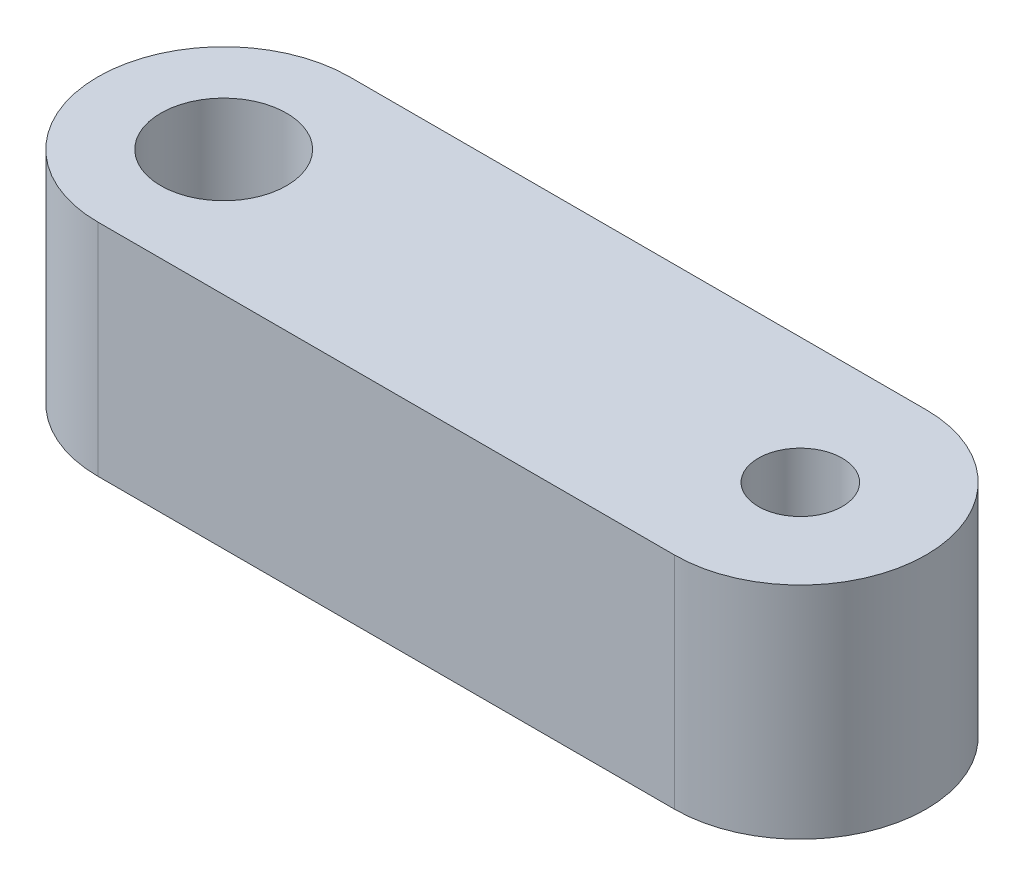
ISO-10303-21;
HEADER;
FILE_DESCRIPTION(('STEP AP214'),'2;1');
FILE_NAME('part.step','',(''),(''),'','','');
FILE_SCHEMA(('AUTOMOTIVE_DESIGN { 1 0 10303 214 1 1 1 1 }'));
ENDSEC;
DATA;
#1=APPLICATION_CONTEXT('core data for automotive mechanical design processes');
#2=APPLICATION_PROTOCOL_DEFINITION('international standard','automotive_design',2000,#1);
#3=PRODUCT_CONTEXT('',#1,'mechanical');
#4=PRODUCT('Part','Part','',(#3));
#5=PRODUCT_RELATED_PRODUCT_CATEGORY('part','',(#4));
#6=PRODUCT_DEFINITION_FORMATION('','',#4);
#7=PRODUCT_DEFINITION_CONTEXT('part definition',#1,'design');
#8=PRODUCT_DEFINITION('design','',#6,#7);
#9=PRODUCT_DEFINITION_SHAPE('','',#8);
#10=(LENGTH_UNIT() NAMED_UNIT(*) SI_UNIT(.MILLI.,.METRE.));
#11=(NAMED_UNIT(*) PLANE_ANGLE_UNIT() SI_UNIT($,.RADIAN.));
#12=(NAMED_UNIT(*) SI_UNIT($,.STERADIAN.) SOLID_ANGLE_UNIT());
#13=UNCERTAINTY_MEASURE_WITH_UNIT(LENGTH_MEASURE(1.E-05),#10,'distance_accuracy_value','');
#14=(GEOMETRIC_REPRESENTATION_CONTEXT(3) GLOBAL_UNCERTAINTY_ASSIGNED_CONTEXT((#13)) GLOBAL_UNIT_ASSIGNED_CONTEXT((#10,
#11,#12)) REPRESENTATION_CONTEXT('',''));
#15=CARTESIAN_POINT('',(0.,0.,0.));
#16=DIRECTION('',(0.,0.,1.));
#17=DIRECTION('',(1.,0.,0.));
#18=AXIS2_PLACEMENT_3D('',#15,#16,#17);
#19=CARTESIAN_POINT('',(0.,5.25,0.));
#20=DIRECTION('',(0.,-1.,0.));
#21=DIRECTION('',(0.,0.,-1.));
#22=AXIS2_PLACEMENT_3D('',#19,#20,#21);
#23=CYLINDRICAL_SURFACE('',#22,3.);
#24=CARTESIAN_POINT('',(0.,0.,0.));
#25=DIRECTION('',(0.,1.,0.));
#26=DIRECTION('',(0.,0.,1.));
#27=AXIS2_PLACEMENT_3D('',#24,#25,#26);
#28=CIRCLE('',#27,3.);
#29=CARTESIAN_POINT('',(0.,0.,-3.));
#30=VERTEX_POINT('',#29);
#31=CARTESIAN_POINT('',(0.,0.,3.));
#32=VERTEX_POINT('',#31);
#33=EDGE_CURVE('E97',#30,#32,#28,.T.);
#34=ORIENTED_EDGE('',*,*,#33,.T.);
#35=DIRECTION('',(0.,-1.,0.));
#36=VECTOR('',#35,1.);
#37=CARTESIAN_POINT('',(0.,5.25,3.));
#38=LINE('',#37,#36);
#39=CARTESIAN_POINT('',(0.,5.25,3.));
#40=VERTEX_POINT('',#39);
#41=EDGE_CURVE('E11',#40,#32,#38,.T.);
#42=ORIENTED_EDGE('',*,*,#41,.F.);
#43=CARTESIAN_POINT('',(0.,5.25,0.));
#44=DIRECTION('',(0.,1.,0.));
#45=DIRECTION('',(0.,0.,1.));
#46=AXIS2_PLACEMENT_3D('',#43,#44,#45);
#47=CIRCLE('',#46,3.);
#48=CARTESIAN_POINT('',(0.,5.25,-3.));
#49=VERTEX_POINT('',#48);
#50=EDGE_CURVE('E85',#49,#40,#47,.T.);
#51=ORIENTED_EDGE('',*,*,#50,.F.);
#52=DIRECTION('',(0.,-1.,0.));
#53=VECTOR('',#52,1.);
#54=CARTESIAN_POINT('',(0.,5.25,-3.));
#55=LINE('',#54,#53);
#56=EDGE_CURVE('E93',#49,#30,#55,.T.);
#57=ORIENTED_EDGE('',*,*,#56,.T.);
#58=EDGE_LOOP('',(#34,#42,#51,#57));
#59=FACE_BOUND('',#58,.T.);
#60=ADVANCED_FACE('F34',(#59),#23,.T.);
#61=CARTESIAN_POINT('',(0.,5.25,3.));
#62=DIRECTION('',(0.,0.,-1.));
#63=DIRECTION('',(-1.,0.,0.));
#64=AXIS2_PLACEMENT_3D('',#61,#62,#63);
#65=PLANE('',#64);
#66=DIRECTION('',(1.,0.,0.));
#67=VECTOR('',#66,1.);
#68=CARTESIAN_POINT('',(0.,0.,3.));
#69=LINE('',#68,#67);
#70=CARTESIAN_POINT('',(13.75,0.,3.));
#71=VERTEX_POINT('',#70);
#72=EDGE_CURVE('E89',#32,#71,#69,.T.);
#73=ORIENTED_EDGE('',*,*,#72,.T.);
#74=DIRECTION('',(0.,-1.,0.));
#75=VECTOR('',#74,1.);
#76=CARTESIAN_POINT('',(13.75,5.25,3.));
#77=LINE('',#76,#75);
#78=CARTESIAN_POINT('',(13.75,5.25,3.));
#79=VERTEX_POINT('',#78);
#80=EDGE_CURVE('E42',#79,#71,#77,.T.);
#81=ORIENTED_EDGE('',*,*,#80,.F.);
#82=DIRECTION('',(1.,0.,0.));
#83=VECTOR('',#82,1.);
#84=CARTESIAN_POINT('',(0.,5.25,3.));
#85=LINE('',#84,#83);
#86=EDGE_CURVE('E80',#40,#79,#85,.T.);
#87=ORIENTED_EDGE('',*,*,#86,.F.);
#88=ORIENTED_EDGE('',*,*,#41,.T.);
#89=EDGE_LOOP('',(#73,#81,#87,#88));
#90=FACE_BOUND('',#89,.T.);
#91=ADVANCED_FACE('F88',(#90),#65,.F.);
#92=CARTESIAN_POINT('',(13.75,5.25,0.));
#93=DIRECTION('',(0.,-1.,0.));
#94=DIRECTION('',(0.,0.,-1.));
#95=AXIS2_PLACEMENT_3D('',#92,#93,#94);
#96=CYLINDRICAL_SURFACE('',#95,3.);
#97=CARTESIAN_POINT('',(13.75,0.,0.));
#98=DIRECTION('',(0.,1.,0.));
#99=DIRECTION('',(0.,0.,1.));
#100=AXIS2_PLACEMENT_3D('',#97,#98,#99);
#101=CIRCLE('',#100,3.);
#102=CARTESIAN_POINT('',(13.75,0.,-3.));
#103=VERTEX_POINT('',#102);
#104=EDGE_CURVE('E67',#71,#103,#101,.T.);
#105=ORIENTED_EDGE('',*,*,#104,.T.);
#106=DIRECTION('',(0.,-1.,0.));
#107=VECTOR('',#106,1.);
#108=CARTESIAN_POINT('',(13.75,5.25,-3.));
#109=LINE('',#108,#107);
#110=CARTESIAN_POINT('',(13.75,5.25,-3.));
#111=VERTEX_POINT('',#110);
#112=EDGE_CURVE('E90',#111,#103,#109,.T.);
#113=ORIENTED_EDGE('',*,*,#112,.F.);
#114=CARTESIAN_POINT('',(13.75,5.25,0.));
#115=DIRECTION('',(0.,1.,0.));
#116=DIRECTION('',(0.,0.,1.));
#117=AXIS2_PLACEMENT_3D('',#114,#115,#116);
#118=CIRCLE('',#117,3.);
#119=EDGE_CURVE('E83',#79,#111,#118,.T.);
#120=ORIENTED_EDGE('',*,*,#119,.F.);
#121=ORIENTED_EDGE('',*,*,#80,.T.);
#122=EDGE_LOOP('',(#105,#113,#120,#121));
#123=FACE_BOUND('',#122,.T.);
#124=ADVANCED_FACE('F91',(#123),#96,.T.);
#125=CARTESIAN_POINT('',(0.,5.25,-3.));
#126=DIRECTION('',(0.,0.,1.));
#127=DIRECTION('',(1.,0.,0.));
#128=AXIS2_PLACEMENT_3D('',#125,#126,#127);
#129=PLANE('',#128);
#130=DIRECTION('',(-1.,0.,0.));
#131=VECTOR('',#130,1.);
#132=CARTESIAN_POINT('',(0.,0.,-3.));
#133=LINE('',#132,#131);
#134=EDGE_CURVE('E73',#103,#30,#133,.T.);
#135=ORIENTED_EDGE('',*,*,#134,.T.);
#136=ORIENTED_EDGE('',*,*,#56,.F.);
#137=DIRECTION('',(-1.,0.,0.));
#138=VECTOR('',#137,1.);
#139=CARTESIAN_POINT('',(0.,5.25,-3.));
#140=LINE('',#139,#138);
#141=EDGE_CURVE('E50',#111,#49,#140,.T.);
#142=ORIENTED_EDGE('',*,*,#141,.F.);
#143=ORIENTED_EDGE('',*,*,#112,.T.);
#144=EDGE_LOOP('',(#135,#136,#142,#143));
#145=FACE_BOUND('',#144,.T.);
#146=ADVANCED_FACE('F105',(#145),#129,.F.);
#147=CARTESIAN_POINT('',(0.,5.25,0.));
#148=DIRECTION('',(0.,1.,0.));
#149=DIRECTION('',(0.,0.,1.));
#150=AXIS2_PLACEMENT_3D('',#147,#148,#149);
#151=PLANE('',#150);
#152=CARTESIAN_POINT('',(0.,5.25,0.));
#153=DIRECTION('',(0.,1.,0.));
#154=DIRECTION('',(0.,0.,1.));
#155=AXIS2_PLACEMENT_3D('',#152,#153,#154);
#156=CIRCLE('',#155,1.5);
#157=CARTESIAN_POINT('',(0.,5.25,1.5));
#158=VERTEX_POINT('',#157);
#159=EDGE_CURVE('E114',#158,#158,#156,.T.);
#160=ORIENTED_EDGE('',*,*,#159,.F.);
#161=EDGE_LOOP('',(#160));
#162=FACE_BOUND('',#161,.T.);
#163=CARTESIAN_POINT('',(13.75,5.25,0.));
#164=DIRECTION('',(0.,1.,0.));
#165=DIRECTION('',(0.,0.,1.));
#166=AXIS2_PLACEMENT_3D('',#163,#164,#165);
#167=CIRCLE('',#166,1.);
#168=CARTESIAN_POINT('',(13.75,5.25,1.));
#169=VERTEX_POINT('',#168);
#170=EDGE_CURVE('E115',#169,#169,#167,.T.);
#171=ORIENTED_EDGE('',*,*,#170,.F.);
#172=EDGE_LOOP('',(#171));
#173=FACE_BOUND('',#172,.T.);
#174=ORIENTED_EDGE('',*,*,#50,.T.);
#175=ORIENTED_EDGE('',*,*,#86,.T.);
#176=ORIENTED_EDGE('',*,*,#119,.T.);
#177=ORIENTED_EDGE('',*,*,#141,.T.);
#178=EDGE_LOOP('',(#174,#175,#176,#177));
#179=FACE_BOUND('',#178,.T.);
#180=ADVANCED_FACE('F81',(#162,#173,#179),#151,.T.);
#181=CARTESIAN_POINT('',(0.,0.,0.));
#182=DIRECTION('',(0.,1.,0.));
#183=DIRECTION('',(0.,0.,1.));
#184=AXIS2_PLACEMENT_3D('',#181,#182,#183);
#185=PLANE('',#184);
#186=CARTESIAN_POINT('',(0.,0.,0.));
#187=DIRECTION('',(0.,1.,0.));
#188=DIRECTION('',(0.,0.,1.));
#189=AXIS2_PLACEMENT_3D('',#186,#187,#188);
#190=CIRCLE('',#189,1.5);
#191=CARTESIAN_POINT('',(0.,0.,1.5));
#192=VERTEX_POINT('',#191);
#193=EDGE_CURVE('E100',#192,#192,#190,.F.);
#194=ORIENTED_EDGE('',*,*,#193,.F.);
#195=EDGE_LOOP('',(#194));
#196=FACE_BOUND('',#195,.T.);
#197=CARTESIAN_POINT('',(13.75,0.,0.));
#198=DIRECTION('',(0.,1.,0.));
#199=DIRECTION('',(0.,0.,1.));
#200=AXIS2_PLACEMENT_3D('',#197,#198,#199);
#201=CIRCLE('',#200,1.);
#202=CARTESIAN_POINT('',(13.75,0.,1.));
#203=VERTEX_POINT('',#202);
#204=EDGE_CURVE('E111',#203,#203,#201,.F.);
#205=ORIENTED_EDGE('',*,*,#204,.F.);
#206=EDGE_LOOP('',(#205));
#207=FACE_BOUND('',#206,.T.);
#208=ORIENTED_EDGE('',*,*,#33,.F.);
#209=ORIENTED_EDGE('',*,*,#134,.F.);
#210=ORIENTED_EDGE('',*,*,#104,.F.);
#211=ORIENTED_EDGE('',*,*,#72,.F.);
#212=EDGE_LOOP('',(#208,#209,#210,#211));
#213=FACE_BOUND('',#212,.T.);
#214=ADVANCED_FACE('F108',(#196,#207,#213),#185,.F.);
#215=CARTESIAN_POINT('',(13.75,-0.00100000000000013,0.));
#216=DIRECTION('',(0.,1.,0.));
#217=DIRECTION('',(0.,0.,1.));
#218=AXIS2_PLACEMENT_3D('',#215,#216,#217);
#219=CYLINDRICAL_SURFACE('',#218,1.);
#220=ORIENTED_EDGE('',*,*,#170,.T.);
#221=EDGE_LOOP('',(#220));
#222=FACE_BOUND('',#221,.T.);
#223=ORIENTED_EDGE('',*,*,#204,.T.);
#224=EDGE_LOOP('',(#223));
#225=FACE_BOUND('',#224,.T.);
#226=ADVANCED_FACE('F131',(#222,#225),#219,.F.);
#227=CARTESIAN_POINT('',(0.,-0.00100000000000013,0.));
#228=DIRECTION('',(0.,1.,0.));
#229=DIRECTION('',(0.,0.,1.));
#230=AXIS2_PLACEMENT_3D('',#227,#228,#229);
#231=CYLINDRICAL_SURFACE('',#230,1.5);
#232=ORIENTED_EDGE('',*,*,#159,.T.);
#233=EDGE_LOOP('',(#232));
#234=FACE_BOUND('',#233,.T.);
#235=ORIENTED_EDGE('',*,*,#193,.T.);
#236=EDGE_LOOP('',(#235));
#237=FACE_BOUND('',#236,.T.);
#238=ADVANCED_FACE('F123',(#234,#237),#231,.F.);
#239=CLOSED_SHELL('',(#60,#91,#124,#146,#180,#214,#226,#238));
#240=MANIFOLD_SOLID_BREP('B2',#239);
#241=ADVANCED_BREP_SHAPE_REPRESENTATION('',(#18,#240),#14);
#242=SHAPE_DEFINITION_REPRESENTATION(#9,#241);
ENDSEC;
END-ISO-10303-21;
